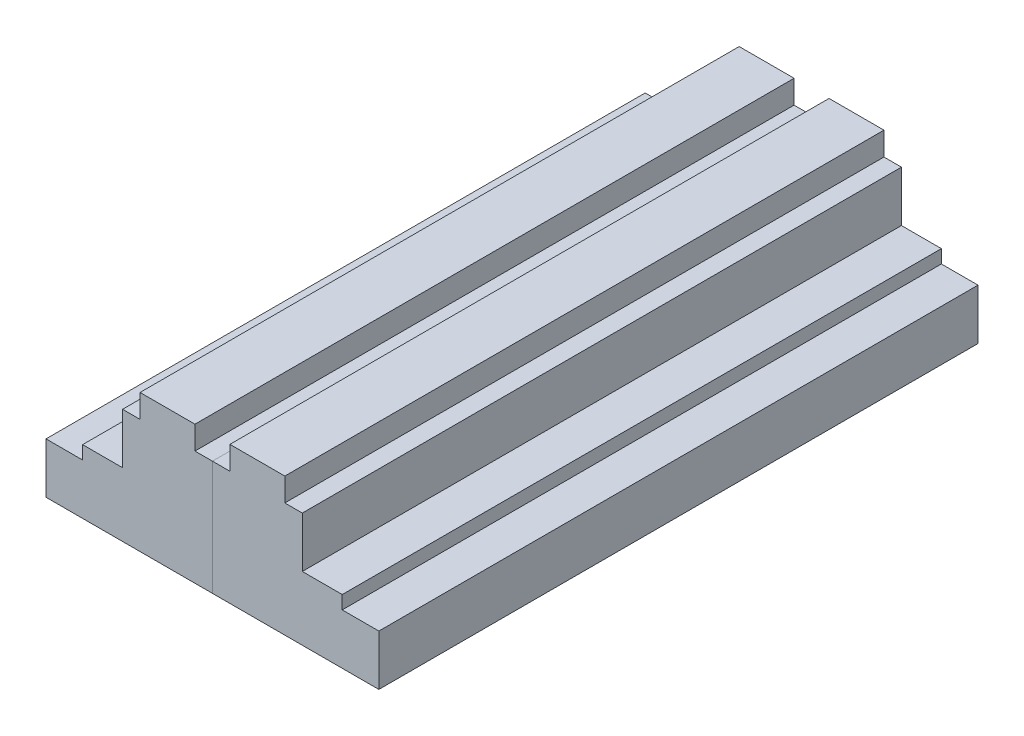
ISO-10303-21;
HEADER;
FILE_DESCRIPTION(('STEP AP214'),'2;1');
FILE_NAME('part.step','',(''),(''),'','','');
FILE_SCHEMA(('AUTOMOTIVE_DESIGN { 1 0 10303 214 1 1 1 1 }'));
ENDSEC;
DATA;
#1=APPLICATION_CONTEXT('core data for automotive mechanical design processes');
#2=APPLICATION_PROTOCOL_DEFINITION('international standard','automotive_design',2000,#1);
#3=PRODUCT_CONTEXT('',#1,'mechanical');
#4=PRODUCT('Part','Part','',(#3));
#5=PRODUCT_RELATED_PRODUCT_CATEGORY('part','',(#4));
#6=PRODUCT_DEFINITION_FORMATION('','',#4);
#7=PRODUCT_DEFINITION_CONTEXT('part definition',#1,'design');
#8=PRODUCT_DEFINITION('design','',#6,#7);
#9=PRODUCT_DEFINITION_SHAPE('','',#8);
#10=(LENGTH_UNIT() NAMED_UNIT(*) SI_UNIT(.MILLI.,.METRE.));
#11=(NAMED_UNIT(*) PLANE_ANGLE_UNIT() SI_UNIT($,.RADIAN.));
#12=(NAMED_UNIT(*) SI_UNIT($,.STERADIAN.) SOLID_ANGLE_UNIT());
#13=UNCERTAINTY_MEASURE_WITH_UNIT(LENGTH_MEASURE(1.E-05),#10,'distance_accuracy_value','');
#14=(GEOMETRIC_REPRESENTATION_CONTEXT(3) GLOBAL_UNCERTAINTY_ASSIGNED_CONTEXT((#13)) GLOBAL_UNIT_ASSIGNED_CONTEXT((#10,
#11,#12)) REPRESENTATION_CONTEXT('',''));
#15=CARTESIAN_POINT('',(0.,0.,0.));
#16=DIRECTION('',(0.,0.,1.));
#17=DIRECTION('',(1.,0.,0.));
#18=AXIS2_PLACEMENT_3D('',#15,#16,#17);
#19=CARTESIAN_POINT('',(25.,0.,90.));
#20=DIRECTION('',(1.,0.,0.));
#21=DIRECTION('',(0.,0.,1.));
#22=AXIS2_PLACEMENT_3D('',#19,#20,#21);
#23=PLANE('',#22);
#24=DIRECTION('',(0.,1.,0.));
#25=VECTOR('',#24,1.);
#26=CARTESIAN_POINT('',(25.,0.,0.));
#27=LINE('',#26,#25);
#28=CARTESIAN_POINT('',(25.,0.,0.));
#29=VERTEX_POINT('',#28);
#30=CARTESIAN_POINT('',(25.,7.59999999999999,0.));
#31=VERTEX_POINT('',#30);
#32=EDGE_CURVE('E171',#29,#31,#27,.T.);
#33=ORIENTED_EDGE('',*,*,#32,.T.);
#34=DIRECTION('',(0.,0.,-1.));
#35=VECTOR('',#34,1.);
#36=CARTESIAN_POINT('',(25.,7.59999999999999,90.));
#37=LINE('',#36,#35);
#38=CARTESIAN_POINT('',(25.,7.59999999999999,90.));
#39=VERTEX_POINT('',#38);
#40=EDGE_CURVE('E54',#39,#31,#37,.T.);
#41=ORIENTED_EDGE('',*,*,#40,.F.);
#42=DIRECTION('',(0.,1.,0.));
#43=VECTOR('',#42,1.);
#44=CARTESIAN_POINT('',(25.,0.,90.));
#45=LINE('',#44,#43);
#46=CARTESIAN_POINT('',(25.,0.,90.));
#47=VERTEX_POINT('',#46);
#48=EDGE_CURVE('E192',#47,#39,#45,.T.);
#49=ORIENTED_EDGE('',*,*,#48,.F.);
#50=DIRECTION('',(0.,0.,-1.));
#51=VECTOR('',#50,1.);
#52=CARTESIAN_POINT('',(25.,0.,90.));
#53=LINE('',#52,#51);
#54=EDGE_CURVE('E12',#47,#29,#53,.T.);
#55=ORIENTED_EDGE('',*,*,#54,.T.);
#56=EDGE_LOOP('',(#33,#41,#49,#55));
#57=FACE_BOUND('',#56,.T.);
#58=ADVANCED_FACE('F51',(#57),#23,.T.);
#59=CARTESIAN_POINT('',(25.,0.,90.));
#60=DIRECTION('',(0.,1.,0.));
#61=DIRECTION('',(0.,0.,1.));
#62=AXIS2_PLACEMENT_3D('',#59,#60,#61);
#63=PLANE('',#62);
#64=DIRECTION('',(-1.,0.,0.));
#65=VECTOR('',#64,1.);
#66=CARTESIAN_POINT('',(25.,0.,0.));
#67=LINE('',#66,#65);
#68=CARTESIAN_POINT('',(0.,0.,0.));
#69=VERTEX_POINT('',#68);
#70=EDGE_CURVE('E116',#29,#69,#67,.T.);
#71=ORIENTED_EDGE('',*,*,#70,.F.);
#72=ORIENTED_EDGE('',*,*,#54,.F.);
#73=DIRECTION('',(-1.,0.,0.));
#74=VECTOR('',#73,1.);
#75=CARTESIAN_POINT('',(25.,0.,90.));
#76=LINE('',#75,#74);
#77=CARTESIAN_POINT('',(0.,0.,90.));
#78=VERTEX_POINT('',#77);
#79=EDGE_CURVE('E69',#47,#78,#76,.T.);
#80=ORIENTED_EDGE('',*,*,#79,.T.);
#81=DIRECTION('',(0.,0.,-1.));
#82=VECTOR('',#81,1.);
#83=CARTESIAN_POINT('',(0.,0.,90.));
#84=LINE('',#83,#82);
#85=EDGE_CURVE('E60',#78,#69,#84,.T.);
#86=ORIENTED_EDGE('',*,*,#85,.T.);
#87=EDGE_LOOP('',(#71,#72,#80,#86));
#88=FACE_BOUND('',#87,.T.);
#89=ADVANCED_FACE('F277',(#88),#63,.F.);
#90=CARTESIAN_POINT('',(0.,17.2,90.));
#91=DIRECTION('',(-1.,0.,0.));
#92=DIRECTION('',(0.,1.,0.));
#93=AXIS2_PLACEMENT_3D('',#90,#91,#92);
#94=PLANE('',#93);
#95=DIRECTION('',(0.,-1.,0.));
#96=VECTOR('',#95,1.);
#97=CARTESIAN_POINT('',(0.,17.2,0.));
#98=LINE('',#97,#96);
#99=CARTESIAN_POINT('',(0.,17.2,0.));
#100=VERTEX_POINT('',#99);
#101=EDGE_CURVE('E110',#100,#69,#98,.T.);
#102=ORIENTED_EDGE('',*,*,#101,.T.);
#103=ORIENTED_EDGE('',*,*,#85,.F.);
#104=DIRECTION('',(0.,-1.,0.));
#105=VECTOR('',#104,1.);
#106=CARTESIAN_POINT('',(0.,17.2,90.));
#107=LINE('',#106,#105);
#108=CARTESIAN_POINT('',(0.,17.2,90.));
#109=VERTEX_POINT('',#108);
#110=EDGE_CURVE('E153',#109,#78,#107,.T.);
#111=ORIENTED_EDGE('',*,*,#110,.F.);
#112=DIRECTION('',(0.,0.,-1.));
#113=VECTOR('',#112,1.);
#114=CARTESIAN_POINT('',(0.,17.2,90.));
#115=LINE('',#114,#113);
#116=EDGE_CURVE('E160',#109,#100,#115,.T.);
#117=ORIENTED_EDGE('',*,*,#116,.T.);
#118=EDGE_LOOP('',(#102,#103,#111,#117));
#119=FACE_BOUND('',#118,.T.);
#120=ADVANCED_FACE('F166',(#119),#94,.T.);
#121=CARTESIAN_POINT('',(2.62500000000001,17.2,90.));
#122=DIRECTION('',(0.,1.,0.));
#123=DIRECTION('',(0.,0.,1.));
#124=AXIS2_PLACEMENT_3D('',#121,#122,#123);
#125=PLANE('',#124);
#126=DIRECTION('',(-1.,0.,0.));
#127=VECTOR('',#126,1.);
#128=CARTESIAN_POINT('',(2.62500000000001,17.2,0.));
#129=LINE('',#128,#127);
#130=CARTESIAN_POINT('',(2.62500000000001,17.2,0.));
#131=VERTEX_POINT('',#130);
#132=EDGE_CURVE('E163',#131,#100,#129,.T.);
#133=ORIENTED_EDGE('',*,*,#132,.T.);
#134=ORIENTED_EDGE('',*,*,#116,.F.);
#135=DIRECTION('',(-1.,0.,0.));
#136=VECTOR('',#135,1.);
#137=CARTESIAN_POINT('',(2.62500000000001,17.2,90.));
#138=LINE('',#137,#136);
#139=CARTESIAN_POINT('',(2.62500000000001,17.2,90.));
#140=VERTEX_POINT('',#139);
#141=EDGE_CURVE('E149',#140,#109,#138,.T.);
#142=ORIENTED_EDGE('',*,*,#141,.F.);
#143=DIRECTION('',(0.,0.,-1.));
#144=VECTOR('',#143,1.);
#145=CARTESIAN_POINT('',(2.62500000000001,17.2,90.));
#146=LINE('',#145,#144);
#147=EDGE_CURVE('E164',#140,#131,#146,.T.);
#148=ORIENTED_EDGE('',*,*,#147,.T.);
#149=EDGE_LOOP('',(#133,#134,#142,#148));
#150=FACE_BOUND('',#149,.T.);
#151=ADVANCED_FACE('F161',(#150),#125,.T.);
#152=CARTESIAN_POINT('',(2.62500000000001,20.7,90.));
#153=DIRECTION('',(-1.,0.,0.));
#154=DIRECTION('',(0.,1.,0.));
#155=AXIS2_PLACEMENT_3D('',#152,#153,#154);
#156=PLANE('',#155);
#157=DIRECTION('',(0.,-1.,0.));
#158=VECTOR('',#157,1.);
#159=CARTESIAN_POINT('',(2.62500000000001,20.7,0.));
#160=LINE('',#159,#158);
#161=CARTESIAN_POINT('',(2.62500000000001,20.7,0.));
#162=VERTEX_POINT('',#161);
#163=EDGE_CURVE('E188',#162,#131,#160,.T.);
#164=ORIENTED_EDGE('',*,*,#163,.T.);
#165=ORIENTED_EDGE('',*,*,#147,.F.);
#166=DIRECTION('',(0.,-1.,0.));
#167=VECTOR('',#166,1.);
#168=CARTESIAN_POINT('',(2.62500000000001,20.7,90.));
#169=LINE('',#168,#167);
#170=CARTESIAN_POINT('',(2.62500000000001,20.7,90.));
#171=VERTEX_POINT('',#170);
#172=EDGE_CURVE('E155',#171,#140,#169,.T.);
#173=ORIENTED_EDGE('',*,*,#172,.F.);
#174=DIRECTION('',(0.,0.,-1.));
#175=VECTOR('',#174,1.);
#176=CARTESIAN_POINT('',(2.62500000000001,20.7,90.));
#177=LINE('',#176,#175);
#178=EDGE_CURVE('E196',#171,#162,#177,.T.);
#179=ORIENTED_EDGE('',*,*,#178,.T.);
#180=EDGE_LOOP('',(#164,#165,#173,#179));
#181=FACE_BOUND('',#180,.T.);
#182=ADVANCED_FACE('F256',(#181),#156,.T.);
#183=CARTESIAN_POINT('',(10.875,20.7,90.));
#184=DIRECTION('',(0.,1.,0.));
#185=DIRECTION('',(1.,0.,0.));
#186=AXIS2_PLACEMENT_3D('',#183,#184,#185);
#187=PLANE('',#186);
#188=DIRECTION('',(-1.,0.,0.));
#189=VECTOR('',#188,1.);
#190=CARTESIAN_POINT('',(10.875,20.7,0.));
#191=LINE('',#190,#189);
#192=CARTESIAN_POINT('',(10.875,20.7,0.));
#193=VERTEX_POINT('',#192);
#194=EDGE_CURVE('E186',#193,#162,#191,.T.);
#195=ORIENTED_EDGE('',*,*,#194,.T.);
#196=ORIENTED_EDGE('',*,*,#178,.F.);
#197=DIRECTION('',(-1.,0.,0.));
#198=VECTOR('',#197,1.);
#199=CARTESIAN_POINT('',(10.875,20.7,90.));
#200=LINE('',#199,#198);
#201=CARTESIAN_POINT('',(10.875,20.7,90.));
#202=VERTEX_POINT('',#201);
#203=EDGE_CURVE('E246',#202,#171,#200,.T.);
#204=ORIENTED_EDGE('',*,*,#203,.F.);
#205=DIRECTION('',(0.,0.,-1.));
#206=VECTOR('',#205,1.);
#207=CARTESIAN_POINT('',(10.875,20.7,90.));
#208=LINE('',#207,#206);
#209=EDGE_CURVE('E199',#202,#193,#208,.T.);
#210=ORIENTED_EDGE('',*,*,#209,.T.);
#211=EDGE_LOOP('',(#195,#196,#204,#210));
#212=FACE_BOUND('',#211,.T.);
#213=ADVANCED_FACE('F252',(#212),#187,.T.);
#214=CARTESIAN_POINT('',(10.875,17.2,90.));
#215=DIRECTION('',(1.,0.,0.));
#216=DIRECTION('',(0.,-1.,0.));
#217=AXIS2_PLACEMENT_3D('',#214,#215,#216);
#218=PLANE('',#217);
#219=DIRECTION('',(0.,1.,0.));
#220=VECTOR('',#219,1.);
#221=CARTESIAN_POINT('',(10.875,17.2,0.));
#222=LINE('',#221,#220);
#223=CARTESIAN_POINT('',(10.875,17.2,0.));
#224=VERTEX_POINT('',#223);
#225=EDGE_CURVE('E184',#224,#193,#222,.T.);
#226=ORIENTED_EDGE('',*,*,#225,.T.);
#227=ORIENTED_EDGE('',*,*,#209,.F.);
#228=DIRECTION('',(0.,1.,0.));
#229=VECTOR('',#228,1.);
#230=CARTESIAN_POINT('',(10.875,17.2,90.));
#231=LINE('',#230,#229);
#232=CARTESIAN_POINT('',(10.875,17.2,90.));
#233=VERTEX_POINT('',#232);
#234=EDGE_CURVE('E244',#233,#202,#231,.T.);
#235=ORIENTED_EDGE('',*,*,#234,.F.);
#236=DIRECTION('',(0.,0.,-1.));
#237=VECTOR('',#236,1.);
#238=CARTESIAN_POINT('',(10.875,17.2,90.));
#239=LINE('',#238,#237);
#240=EDGE_CURVE('E202',#233,#224,#239,.T.);
#241=ORIENTED_EDGE('',*,*,#240,.T.);
#242=EDGE_LOOP('',(#226,#227,#235,#241));
#243=FACE_BOUND('',#242,.T.);
#244=ADVANCED_FACE('F260',(#243),#218,.T.);
#245=CARTESIAN_POINT('',(13.5,17.2,90.));
#246=DIRECTION('',(0.,1.,0.));
#247=DIRECTION('',(0.,0.,1.));
#248=AXIS2_PLACEMENT_3D('',#245,#246,#247);
#249=PLANE('',#248);
#250=DIRECTION('',(-1.,0.,0.));
#251=VECTOR('',#250,1.);
#252=CARTESIAN_POINT('',(13.5,17.2,0.));
#253=LINE('',#252,#251);
#254=CARTESIAN_POINT('',(13.5,17.2,0.));
#255=VERTEX_POINT('',#254);
#256=EDGE_CURVE('E182',#255,#224,#253,.T.);
#257=ORIENTED_EDGE('',*,*,#256,.T.);
#258=ORIENTED_EDGE('',*,*,#240,.F.);
#259=DIRECTION('',(-1.,0.,0.));
#260=VECTOR('',#259,1.);
#261=CARTESIAN_POINT('',(13.5,17.2,90.));
#262=LINE('',#261,#260);
#263=CARTESIAN_POINT('',(13.5,17.2,90.));
#264=VERTEX_POINT('',#263);
#265=EDGE_CURVE('E238',#264,#233,#262,.T.);
#266=ORIENTED_EDGE('',*,*,#265,.F.);
#267=DIRECTION('',(0.,0.,-1.));
#268=VECTOR('',#267,1.);
#269=CARTESIAN_POINT('',(13.5,17.2,90.));
#270=LINE('',#269,#268);
#271=EDGE_CURVE('E205',#264,#255,#270,.T.);
#272=ORIENTED_EDGE('',*,*,#271,.T.);
#273=EDGE_LOOP('',(#257,#258,#266,#272));
#274=FACE_BOUND('',#273,.T.);
#275=ADVANCED_FACE('F264',(#274),#249,.T.);
#276=CARTESIAN_POINT('',(13.5,9.6,90.));
#277=DIRECTION('',(1.,0.,0.));
#278=DIRECTION('',(0.,-1.,0.));
#279=AXIS2_PLACEMENT_3D('',#276,#277,#278);
#280=PLANE('',#279);
#281=DIRECTION('',(0.,1.,0.));
#282=VECTOR('',#281,1.);
#283=CARTESIAN_POINT('',(13.5,9.6,0.));
#284=LINE('',#283,#282);
#285=CARTESIAN_POINT('',(13.5,9.6,0.));
#286=VERTEX_POINT('',#285);
#287=EDGE_CURVE('E180',#286,#255,#284,.T.);
#288=ORIENTED_EDGE('',*,*,#287,.T.);
#289=ORIENTED_EDGE('',*,*,#271,.F.);
#290=DIRECTION('',(0.,1.,0.));
#291=VECTOR('',#290,1.);
#292=CARTESIAN_POINT('',(13.5,9.6,90.));
#293=LINE('',#292,#291);
#294=CARTESIAN_POINT('',(13.5,9.6,90.));
#295=VERTEX_POINT('',#294);
#296=EDGE_CURVE('E235',#295,#264,#293,.T.);
#297=ORIENTED_EDGE('',*,*,#296,.F.);
#298=DIRECTION('',(0.,0.,-1.));
#299=VECTOR('',#298,1.);
#300=CARTESIAN_POINT('',(13.5,9.6,90.));
#301=LINE('',#300,#299);
#302=EDGE_CURVE('E208',#295,#286,#301,.T.);
#303=ORIENTED_EDGE('',*,*,#302,.T.);
#304=EDGE_LOOP('',(#288,#289,#297,#303));
#305=FACE_BOUND('',#304,.T.);
#306=ADVANCED_FACE('F267',(#305),#280,.T.);
#307=CARTESIAN_POINT('',(19.5,9.59999999999999,90.));
#308=DIRECTION('',(0.,1.,0.));
#309=DIRECTION('',(0.,0.,1.));
#310=AXIS2_PLACEMENT_3D('',#307,#308,#309);
#311=PLANE('',#310);
#312=DIRECTION('',(-1.,0.,0.));
#313=VECTOR('',#312,1.);
#314=CARTESIAN_POINT('',(19.5,9.59999999999999,0.));
#315=LINE('',#314,#313);
#316=CARTESIAN_POINT('',(19.5,9.59999999999999,0.));
#317=VERTEX_POINT('',#316);
#318=EDGE_CURVE('E178',#317,#286,#315,.T.);
#319=ORIENTED_EDGE('',*,*,#318,.T.);
#320=ORIENTED_EDGE('',*,*,#302,.F.);
#321=DIRECTION('',(-1.,0.,0.));
#322=VECTOR('',#321,1.);
#323=CARTESIAN_POINT('',(19.5,9.59999999999999,90.));
#324=LINE('',#323,#322);
#325=CARTESIAN_POINT('',(19.5,9.59999999999999,90.));
#326=VERTEX_POINT('',#325);
#327=EDGE_CURVE('E233',#326,#295,#324,.T.);
#328=ORIENTED_EDGE('',*,*,#327,.F.);
#329=DIRECTION('',(0.,0.,-1.));
#330=VECTOR('',#329,1.);
#331=CARTESIAN_POINT('',(19.5,9.59999999999999,90.));
#332=LINE('',#331,#330);
#333=EDGE_CURVE('E211',#326,#317,#332,.T.);
#334=ORIENTED_EDGE('',*,*,#333,.T.);
#335=EDGE_LOOP('',(#319,#320,#328,#334));
#336=FACE_BOUND('',#335,.T.);
#337=ADVANCED_FACE('F231',(#336),#311,.T.);
#338=CARTESIAN_POINT('',(19.5,7.59999999999999,90.));
#339=DIRECTION('',(1.,0.,0.));
#340=DIRECTION('',(0.,0.,1.));
#341=AXIS2_PLACEMENT_3D('',#338,#339,#340);
#342=PLANE('',#341);
#343=DIRECTION('',(0.,1.,0.));
#344=VECTOR('',#343,1.);
#345=CARTESIAN_POINT('',(19.5,7.59999999999999,0.));
#346=LINE('',#345,#344);
#347=CARTESIAN_POINT('',(19.5,7.59999999999999,0.));
#348=VERTEX_POINT('',#347);
#349=EDGE_CURVE('E176',#348,#317,#346,.T.);
#350=ORIENTED_EDGE('',*,*,#349,.T.);
#351=ORIENTED_EDGE('',*,*,#333,.F.);
#352=DIRECTION('',(0.,1.,0.));
#353=VECTOR('',#352,1.);
#354=CARTESIAN_POINT('',(19.5,7.59999999999999,90.));
#355=LINE('',#354,#353);
#356=CARTESIAN_POINT('',(19.5,7.59999999999999,90.));
#357=VERTEX_POINT('',#356);
#358=EDGE_CURVE('E236',#357,#326,#355,.T.);
#359=ORIENTED_EDGE('',*,*,#358,.F.);
#360=DIRECTION('',(0.,0.,-1.));
#361=VECTOR('',#360,1.);
#362=CARTESIAN_POINT('',(19.5,7.59999999999999,90.));
#363=LINE('',#362,#361);
#364=EDGE_CURVE('E213',#357,#348,#363,.T.);
#365=ORIENTED_EDGE('',*,*,#364,.T.);
#366=EDGE_LOOP('',(#350,#351,#359,#365));
#367=FACE_BOUND('',#366,.T.);
#368=ADVANCED_FACE('F228',(#367),#342,.T.);
#369=CARTESIAN_POINT('',(25.,7.59999999999999,90.));
#370=DIRECTION('',(0.,1.,0.));
#371=DIRECTION('',(0.,0.,1.));
#372=AXIS2_PLACEMENT_3D('',#369,#370,#371);
#373=PLANE('',#372);
#374=DIRECTION('',(-1.,0.,0.));
#375=VECTOR('',#374,1.);
#376=CARTESIAN_POINT('',(25.,7.59999999999999,0.));
#377=LINE('',#376,#375);
#378=EDGE_CURVE('E174',#31,#348,#377,.T.);
#379=ORIENTED_EDGE('',*,*,#378,.T.);
#380=ORIENTED_EDGE('',*,*,#364,.F.);
#381=DIRECTION('',(-1.,0.,0.));
#382=VECTOR('',#381,1.);
#383=CARTESIAN_POINT('',(25.,7.59999999999999,90.));
#384=LINE('',#383,#382);
#385=EDGE_CURVE('E124',#39,#357,#384,.T.);
#386=ORIENTED_EDGE('',*,*,#385,.F.);
#387=ORIENTED_EDGE('',*,*,#40,.T.);
#388=EDGE_LOOP('',(#379,#380,#386,#387));
#389=FACE_BOUND('',#388,.T.);
#390=ADVANCED_FACE('F219',(#389),#373,.T.);
#391=CARTESIAN_POINT('',(0.,0.,90.));
#392=DIRECTION('',(0.,0.,-1.));
#393=DIRECTION('',(1.,0.,0.));
#394=AXIS2_PLACEMENT_3D('',#391,#392,#393);
#395=PLANE('',#394);
#396=ORIENTED_EDGE('',*,*,#48,.T.);
#397=ORIENTED_EDGE('',*,*,#385,.T.);
#398=ORIENTED_EDGE('',*,*,#358,.T.);
#399=ORIENTED_EDGE('',*,*,#327,.T.);
#400=ORIENTED_EDGE('',*,*,#296,.T.);
#401=ORIENTED_EDGE('',*,*,#265,.T.);
#402=ORIENTED_EDGE('',*,*,#234,.T.);
#403=ORIENTED_EDGE('',*,*,#203,.T.);
#404=ORIENTED_EDGE('',*,*,#172,.T.);
#405=ORIENTED_EDGE('',*,*,#141,.T.);
#406=ORIENTED_EDGE('',*,*,#110,.T.);
#407=ORIENTED_EDGE('',*,*,#79,.F.);
#408=EDGE_LOOP('',(#396,#397,#398,#399,#400,#401,#402,#403,#404,#405,#406,#407));
#409=FACE_BOUND('',#408,.T.);
#410=ADVANCED_FACE('F151',(#409),#395,.F.);
#411=CARTESIAN_POINT('',(0.,0.,0.));
#412=DIRECTION('',(0.,0.,-1.));
#413=DIRECTION('',(1.,0.,0.));
#414=AXIS2_PLACEMENT_3D('',#411,#412,#413);
#415=PLANE('',#414);
#416=ORIENTED_EDGE('',*,*,#32,.F.);
#417=ORIENTED_EDGE('',*,*,#70,.T.);
#418=ORIENTED_EDGE('',*,*,#101,.F.);
#419=ORIENTED_EDGE('',*,*,#132,.F.);
#420=ORIENTED_EDGE('',*,*,#163,.F.);
#421=ORIENTED_EDGE('',*,*,#194,.F.);
#422=ORIENTED_EDGE('',*,*,#225,.F.);
#423=ORIENTED_EDGE('',*,*,#256,.F.);
#424=ORIENTED_EDGE('',*,*,#287,.F.);
#425=ORIENTED_EDGE('',*,*,#318,.F.);
#426=ORIENTED_EDGE('',*,*,#349,.F.);
#427=ORIENTED_EDGE('',*,*,#378,.F.);
#428=EDGE_LOOP('',(#416,#417,#418,#419,#420,#421,#422,#423,#424,#425,#426,#427));
#429=FACE_BOUND('',#428,.T.);
#430=ADVANCED_FACE('F224',(#429),#415,.T.);
#431=CLOSED_SHELL('',(#58,#89,#120,#151,#182,#213,#244,#275,#306,#337,#368,#390,#410,#430));
#432=MANIFOLD_SOLID_BREP('B2',#431);
#433=CARTESIAN_POINT('',(-25.,0.,90.));
#434=DIRECTION('',(-1.,0.,0.));
#435=DIRECTION('',(0.,0.,1.));
#436=AXIS2_PLACEMENT_3D('',#433,#434,#435);
#437=PLANE('',#436);
#438=DIRECTION('',(0.,1.,0.));
#439=VECTOR('',#438,1.);
#440=CARTESIAN_POINT('',(-25.,0.,0.));
#441=LINE('',#440,#439);
#442=CARTESIAN_POINT('',(-25.,0.,0.));
#443=VERTEX_POINT('',#442);
#444=CARTESIAN_POINT('',(-25.,7.6,0.));
#445=VERTEX_POINT('',#444);
#446=EDGE_CURVE('E505',#443,#445,#441,.T.);
#447=ORIENTED_EDGE('',*,*,#446,.F.);
#448=DIRECTION('',(0.,0.,-1.));
#449=VECTOR('',#448,1.);
#450=CARTESIAN_POINT('',(-25.,0.,90.));
#451=LINE('',#450,#449);
#452=CARTESIAN_POINT('',(-25.,0.,90.));
#453=VERTEX_POINT('',#452);
#454=EDGE_CURVE('E49',#453,#443,#451,.T.);
#455=ORIENTED_EDGE('',*,*,#454,.F.);
#456=DIRECTION('',(0.,1.,0.));
#457=VECTOR('',#456,1.);
#458=CARTESIAN_POINT('',(-25.,0.,90.));
#459=LINE('',#458,#457);
#460=CARTESIAN_POINT('',(-25.,7.6,90.));
#461=VERTEX_POINT('',#460);
#462=EDGE_CURVE('E536',#453,#461,#459,.T.);
#463=ORIENTED_EDGE('',*,*,#462,.T.);
#464=DIRECTION('',(0.,0.,-1.));
#465=VECTOR('',#464,1.);
#466=CARTESIAN_POINT('',(-25.,7.6,90.));
#467=LINE('',#466,#465);
#468=EDGE_CURVE('E386',#461,#445,#467,.T.);
#469=ORIENTED_EDGE('',*,*,#468,.T.);
#470=EDGE_LOOP('',(#447,#455,#463,#469));
#471=FACE_BOUND('',#470,.T.);
#472=ADVANCED_FACE('F383',(#471),#437,.T.);
#473=CARTESIAN_POINT('',(-25.,0.,90.));
#474=DIRECTION('',(0.,1.,0.));
#475=DIRECTION('',(0.,0.,1.));
#476=AXIS2_PLACEMENT_3D('',#473,#474,#475);
#477=PLANE('',#476);
#478=DIRECTION('',(1.,0.,0.));
#479=VECTOR('',#478,1.);
#480=CARTESIAN_POINT('',(-25.,0.,0.));
#481=LINE('',#480,#479);
#482=CARTESIAN_POINT('',(0.,0.,0.));
#483=VERTEX_POINT('',#482);
#484=EDGE_CURVE('E535',#443,#483,#481,.T.);
#485=ORIENTED_EDGE('',*,*,#484,.T.);
#486=DIRECTION('',(0.,0.,-1.));
#487=VECTOR('',#486,1.);
#488=CARTESIAN_POINT('',(0.,0.,90.));
#489=LINE('',#488,#487);
#490=CARTESIAN_POINT('',(0.,0.,90.));
#491=VERTEX_POINT('',#490);
#492=EDGE_CURVE('E392',#491,#483,#489,.T.);
#493=ORIENTED_EDGE('',*,*,#492,.F.);
#494=DIRECTION('',(1.,0.,0.));
#495=VECTOR('',#494,1.);
#496=CARTESIAN_POINT('',(-25.,0.,90.));
#497=LINE('',#496,#495);
#498=EDGE_CURVE('E495',#453,#491,#497,.T.);
#499=ORIENTED_EDGE('',*,*,#498,.F.);
#500=ORIENTED_EDGE('',*,*,#454,.T.);
#501=EDGE_LOOP('',(#485,#493,#499,#500));
#502=FACE_BOUND('',#501,.T.);
#503=ADVANCED_FACE('F556',(#502),#477,.F.);
#504=CARTESIAN_POINT('',(0.,17.2,90.));
#505=DIRECTION('',(1.,0.,0.));
#506=DIRECTION('',(0.,1.,0.));
#507=AXIS2_PLACEMENT_3D('',#504,#505,#506);
#508=PLANE('',#507);
#509=DIRECTION('',(0.,-1.,0.));
#510=VECTOR('',#509,1.);
#511=CARTESIAN_POINT('',(0.,17.2,0.));
#512=LINE('',#511,#510);
#513=CARTESIAN_POINT('',(0.,17.2,0.));
#514=VERTEX_POINT('',#513);
#515=EDGE_CURVE('E481',#514,#483,#512,.T.);
#516=ORIENTED_EDGE('',*,*,#515,.F.);
#517=DIRECTION('',(0.,0.,-1.));
#518=VECTOR('',#517,1.);
#519=CARTESIAN_POINT('',(0.,17.2,90.));
#520=LINE('',#519,#518);
#521=CARTESIAN_POINT('',(0.,17.2,90.));
#522=VERTEX_POINT('',#521);
#523=EDGE_CURVE('E476',#522,#514,#520,.T.);
#524=ORIENTED_EDGE('',*,*,#523,.F.);
#525=DIRECTION('',(0.,-1.,0.));
#526=VECTOR('',#525,1.);
#527=CARTESIAN_POINT('',(0.,17.2,90.));
#528=LINE('',#527,#526);
#529=EDGE_CURVE('E479',#522,#491,#528,.T.);
#530=ORIENTED_EDGE('',*,*,#529,.T.);
#531=ORIENTED_EDGE('',*,*,#492,.T.);
#532=EDGE_LOOP('',(#516,#524,#530,#531));
#533=FACE_BOUND('',#532,.T.);
#534=ADVANCED_FACE('F478',(#533),#508,.T.);
#535=CARTESIAN_POINT('',(-2.625,17.2,90.));
#536=DIRECTION('',(0.,1.,0.));
#537=DIRECTION('',(0.,0.,1.));
#538=AXIS2_PLACEMENT_3D('',#535,#536,#537);
#539=PLANE('',#538);
#540=DIRECTION('',(1.,0.,0.));
#541=VECTOR('',#540,1.);
#542=CARTESIAN_POINT('',(-2.625,17.2,0.));
#543=LINE('',#542,#541);
#544=CARTESIAN_POINT('',(-2.625,17.2,0.));
#545=VERTEX_POINT('',#544);
#546=EDGE_CURVE('E532',#545,#514,#543,.T.);
#547=ORIENTED_EDGE('',*,*,#546,.F.);
#548=DIRECTION('',(0.,0.,-1.));
#549=VECTOR('',#548,1.);
#550=CARTESIAN_POINT('',(-2.625,17.2,90.));
#551=LINE('',#550,#549);
#552=CARTESIAN_POINT('',(-2.625,17.2,90.));
#553=VERTEX_POINT('',#552);
#554=EDGE_CURVE('E486',#553,#545,#551,.T.);
#555=ORIENTED_EDGE('',*,*,#554,.F.);
#556=DIRECTION('',(1.,0.,0.));
#557=VECTOR('',#556,1.);
#558=CARTESIAN_POINT('',(-2.625,17.2,90.));
#559=LINE('',#558,#557);
#560=EDGE_CURVE('E493',#553,#522,#559,.T.);
#561=ORIENTED_EDGE('',*,*,#560,.T.);
#562=ORIENTED_EDGE('',*,*,#523,.T.);
#563=EDGE_LOOP('',(#547,#555,#561,#562));
#564=FACE_BOUND('',#563,.T.);
#565=ADVANCED_FACE('F497',(#564),#539,.T.);
#566=CARTESIAN_POINT('',(-2.625,20.7,90.));
#567=DIRECTION('',(1.,0.,0.));
#568=DIRECTION('',(0.,1.,0.));
#569=AXIS2_PLACEMENT_3D('',#566,#567,#568);
#570=PLANE('',#569);
#571=DIRECTION('',(0.,-1.,0.));
#572=VECTOR('',#571,1.);
#573=CARTESIAN_POINT('',(-2.625,20.7,0.));
#574=LINE('',#573,#572);
#575=CARTESIAN_POINT('',(-2.625,20.7,0.));
#576=VERTEX_POINT('',#575);
#577=EDGE_CURVE('E529',#576,#545,#574,.T.);
#578=ORIENTED_EDGE('',*,*,#577,.F.);
#579=DIRECTION('',(0.,0.,-1.));
#580=VECTOR('',#579,1.);
#581=CARTESIAN_POINT('',(-2.625,20.7,90.));
#582=LINE('',#581,#580);
#583=CARTESIAN_POINT('',(-2.625,20.7,90.));
#584=VERTEX_POINT('',#583);
#585=EDGE_CURVE('E540',#584,#576,#582,.T.);
#586=ORIENTED_EDGE('',*,*,#585,.F.);
#587=DIRECTION('',(0.,-1.,0.));
#588=VECTOR('',#587,1.);
#589=CARTESIAN_POINT('',(-2.625,20.7,90.));
#590=LINE('',#589,#588);
#591=EDGE_CURVE('E498',#584,#553,#590,.T.);
#592=ORIENTED_EDGE('',*,*,#591,.T.);
#593=ORIENTED_EDGE('',*,*,#554,.T.);
#594=EDGE_LOOP('',(#578,#586,#592,#593));
#595=FACE_BOUND('',#594,.T.);
#596=ADVANCED_FACE('F601',(#595),#570,.T.);
#597=CARTESIAN_POINT('',(-10.875,20.7,90.));
#598=DIRECTION('',(0.,1.,0.));
#599=DIRECTION('',(-1.,0.,0.));
#600=AXIS2_PLACEMENT_3D('',#597,#598,#599);
#601=PLANE('',#600);
#602=DIRECTION('',(1.,0.,0.));
#603=VECTOR('',#602,1.);
#604=CARTESIAN_POINT('',(-10.875,20.7,0.));
#605=LINE('',#604,#603);
#606=CARTESIAN_POINT('',(-10.875,20.7,0.));
#607=VERTEX_POINT('',#606);
#608=EDGE_CURVE('E526',#607,#576,#605,.T.);
#609=ORIENTED_EDGE('',*,*,#608,.F.);
#610=DIRECTION('',(0.,0.,-1.));
#611=VECTOR('',#610,1.);
#612=CARTESIAN_POINT('',(-10.875,20.7,90.));
#613=LINE('',#612,#611);
#614=CARTESIAN_POINT('',(-10.875,20.7,90.));
#615=VERTEX_POINT('',#614);
#616=EDGE_CURVE('E542',#615,#607,#613,.T.);
#617=ORIENTED_EDGE('',*,*,#616,.F.);
#618=DIRECTION('',(1.,0.,0.));
#619=VECTOR('',#618,1.);
#620=CARTESIAN_POINT('',(-10.875,20.7,90.));
#621=LINE('',#620,#619);
#622=EDGE_CURVE('E500',#615,#584,#621,.T.);
#623=ORIENTED_EDGE('',*,*,#622,.T.);
#624=ORIENTED_EDGE('',*,*,#585,.T.);
#625=EDGE_LOOP('',(#609,#617,#623,#624));
#626=FACE_BOUND('',#625,.T.);
#627=ADVANCED_FACE('F580',(#626),#601,.T.);
#628=CARTESIAN_POINT('',(-10.875,17.2,90.));
#629=DIRECTION('',(-1.,0.,0.));
#630=DIRECTION('',(0.,-1.,0.));
#631=AXIS2_PLACEMENT_3D('',#628,#629,#630);
#632=PLANE('',#631);
#633=DIRECTION('',(0.,1.,0.));
#634=VECTOR('',#633,1.);
#635=CARTESIAN_POINT('',(-10.875,17.2,0.));
#636=LINE('',#635,#634);
#637=CARTESIAN_POINT('',(-10.875,17.2,0.));
#638=VERTEX_POINT('',#637);
#639=EDGE_CURVE('E523',#638,#607,#636,.T.);
#640=ORIENTED_EDGE('',*,*,#639,.F.);
#641=DIRECTION('',(0.,0.,-1.));
#642=VECTOR('',#641,1.);
#643=CARTESIAN_POINT('',(-10.875,17.2,90.));
#644=LINE('',#643,#642);
#645=CARTESIAN_POINT('',(-10.875,17.2,90.));
#646=VERTEX_POINT('',#645);
#647=EDGE_CURVE('E544',#646,#638,#644,.T.);
#648=ORIENTED_EDGE('',*,*,#647,.F.);
#649=DIRECTION('',(0.,1.,0.));
#650=VECTOR('',#649,1.);
#651=CARTESIAN_POINT('',(-10.875,17.2,90.));
#652=LINE('',#651,#650);
#653=EDGE_CURVE('E574',#646,#615,#652,.T.);
#654=ORIENTED_EDGE('',*,*,#653,.T.);
#655=ORIENTED_EDGE('',*,*,#616,.T.);
#656=EDGE_LOOP('',(#640,#648,#654,#655));
#657=FACE_BOUND('',#656,.T.);
#658=ADVANCED_FACE('F586',(#657),#632,.T.);
#659=CARTESIAN_POINT('',(-13.5,17.2,90.));
#660=DIRECTION('',(0.,1.,0.));
#661=DIRECTION('',(0.,0.,1.));
#662=AXIS2_PLACEMENT_3D('',#659,#660,#661);
#663=PLANE('',#662);
#664=DIRECTION('',(1.,0.,0.));
#665=VECTOR('',#664,1.);
#666=CARTESIAN_POINT('',(-13.5,17.2,0.));
#667=LINE('',#666,#665);
#668=CARTESIAN_POINT('',(-13.5,17.2,0.));
#669=VERTEX_POINT('',#668);
#670=EDGE_CURVE('E520',#669,#638,#667,.T.);
#671=ORIENTED_EDGE('',*,*,#670,.F.);
#672=DIRECTION('',(0.,0.,-1.));
#673=VECTOR('',#672,1.);
#674=CARTESIAN_POINT('',(-13.5,17.2,90.));
#675=LINE('',#674,#673);
#676=CARTESIAN_POINT('',(-13.5,17.2,90.));
#677=VERTEX_POINT('',#676);
#678=EDGE_CURVE('E546',#677,#669,#675,.T.);
#679=ORIENTED_EDGE('',*,*,#678,.F.);
#680=DIRECTION('',(1.,0.,0.));
#681=VECTOR('',#680,1.);
#682=CARTESIAN_POINT('',(-13.5,17.2,90.));
#683=LINE('',#682,#681);
#684=EDGE_CURVE('E571',#677,#646,#683,.T.);
#685=ORIENTED_EDGE('',*,*,#684,.T.);
#686=ORIENTED_EDGE('',*,*,#647,.T.);
#687=EDGE_LOOP('',(#671,#679,#685,#686));
#688=FACE_BOUND('',#687,.T.);
#689=ADVANCED_FACE('F589',(#688),#663,.T.);
#690=CARTESIAN_POINT('',(-13.5,9.6,90.));
#691=DIRECTION('',(-1.,0.,0.));
#692=DIRECTION('',(0.,-1.,0.));
#693=AXIS2_PLACEMENT_3D('',#690,#691,#692);
#694=PLANE('',#693);
#695=DIRECTION('',(0.,1.,0.));
#696=VECTOR('',#695,1.);
#697=CARTESIAN_POINT('',(-13.5,9.6,0.));
#698=LINE('',#697,#696);
#699=CARTESIAN_POINT('',(-13.5,9.6,0.));
#700=VERTEX_POINT('',#699);
#701=EDGE_CURVE('E517',#700,#669,#698,.T.);
#702=ORIENTED_EDGE('',*,*,#701,.F.);
#703=DIRECTION('',(0.,0.,-1.));
#704=VECTOR('',#703,1.);
#705=CARTESIAN_POINT('',(-13.5,9.6,90.));
#706=LINE('',#705,#704);
#707=CARTESIAN_POINT('',(-13.5,9.6,90.));
#708=VERTEX_POINT('',#707);
#709=EDGE_CURVE('E548',#708,#700,#706,.T.);
#710=ORIENTED_EDGE('',*,*,#709,.F.);
#711=DIRECTION('',(0.,1.,0.));
#712=VECTOR('',#711,1.);
#713=CARTESIAN_POINT('',(-13.5,9.6,90.));
#714=LINE('',#713,#712);
#715=EDGE_CURVE('E568',#708,#677,#714,.T.);
#716=ORIENTED_EDGE('',*,*,#715,.T.);
#717=ORIENTED_EDGE('',*,*,#678,.T.);
#718=EDGE_LOOP('',(#702,#710,#716,#717));
#719=FACE_BOUND('',#718,.T.);
#720=ADVANCED_FACE('F594',(#719),#694,.T.);
#721=CARTESIAN_POINT('',(-19.5,9.6,90.));
#722=DIRECTION('',(0.,1.,0.));
#723=DIRECTION('',(0.,0.,1.));
#724=AXIS2_PLACEMENT_3D('',#721,#722,#723);
#725=PLANE('',#724);
#726=DIRECTION('',(1.,0.,0.));
#727=VECTOR('',#726,1.);
#728=CARTESIAN_POINT('',(-19.5,9.6,0.));
#729=LINE('',#728,#727);
#730=CARTESIAN_POINT('',(-19.5,9.6,0.));
#731=VERTEX_POINT('',#730);
#732=EDGE_CURVE('E514',#731,#700,#729,.T.);
#733=ORIENTED_EDGE('',*,*,#732,.F.);
#734=DIRECTION('',(0.,0.,-1.));
#735=VECTOR('',#734,1.);
#736=CARTESIAN_POINT('',(-19.5,9.6,90.));
#737=LINE('',#736,#735);
#738=CARTESIAN_POINT('',(-19.5,9.6,90.));
#739=VERTEX_POINT('',#738);
#740=EDGE_CURVE('E550',#739,#731,#737,.T.);
#741=ORIENTED_EDGE('',*,*,#740,.F.);
#742=DIRECTION('',(1.,0.,0.));
#743=VECTOR('',#742,1.);
#744=CARTESIAN_POINT('',(-19.5,9.6,90.));
#745=LINE('',#744,#743);
#746=EDGE_CURVE('E565',#739,#708,#745,.T.);
#747=ORIENTED_EDGE('',*,*,#746,.T.);
#748=ORIENTED_EDGE('',*,*,#709,.T.);
#749=EDGE_LOOP('',(#733,#741,#747,#748));
#750=FACE_BOUND('',#749,.T.);
#751=ADVANCED_FACE('F597',(#750),#725,.T.);
#752=CARTESIAN_POINT('',(-19.5,7.6,90.));
#753=DIRECTION('',(-1.,0.,0.));
#754=DIRECTION('',(0.,0.,1.));
#755=AXIS2_PLACEMENT_3D('',#752,#753,#754);
#756=PLANE('',#755);
#757=DIRECTION('',(0.,1.,0.));
#758=VECTOR('',#757,1.);
#759=CARTESIAN_POINT('',(-19.5,7.6,0.));
#760=LINE('',#759,#758);
#761=CARTESIAN_POINT('',(-19.5,7.6,0.));
#762=VERTEX_POINT('',#761);
#763=EDGE_CURVE('E511',#762,#731,#760,.T.);
#764=ORIENTED_EDGE('',*,*,#763,.F.);
#765=DIRECTION('',(0.,0.,-1.));
#766=VECTOR('',#765,1.);
#767=CARTESIAN_POINT('',(-19.5,7.6,90.));
#768=LINE('',#767,#766);
#769=CARTESIAN_POINT('',(-19.5,7.6,90.));
#770=VERTEX_POINT('',#769);
#771=EDGE_CURVE('E551',#770,#762,#768,.T.);
#772=ORIENTED_EDGE('',*,*,#771,.F.);
#773=DIRECTION('',(0.,1.,0.));
#774=VECTOR('',#773,1.);
#775=CARTESIAN_POINT('',(-19.5,7.6,90.));
#776=LINE('',#775,#774);
#777=EDGE_CURVE('E560',#770,#739,#776,.T.);
#778=ORIENTED_EDGE('',*,*,#777,.T.);
#779=ORIENTED_EDGE('',*,*,#740,.T.);
#780=EDGE_LOOP('',(#764,#772,#778,#779));
#781=FACE_BOUND('',#780,.T.);
#782=ADVANCED_FACE('F599',(#781),#756,.T.);
#783=CARTESIAN_POINT('',(-25.,7.6,90.));
#784=DIRECTION('',(0.,1.,0.));
#785=DIRECTION('',(0.,0.,1.));
#786=AXIS2_PLACEMENT_3D('',#783,#784,#785);
#787=PLANE('',#786);
#788=DIRECTION('',(1.,0.,0.));
#789=VECTOR('',#788,1.);
#790=CARTESIAN_POINT('',(-25.,7.6,0.));
#791=LINE('',#790,#789);
#792=EDGE_CURVE('E508',#445,#762,#791,.T.);
#793=ORIENTED_EDGE('',*,*,#792,.F.);
#794=ORIENTED_EDGE('',*,*,#468,.F.);
#795=DIRECTION('',(1.,0.,0.));
#796=VECTOR('',#795,1.);
#797=CARTESIAN_POINT('',(-25.,7.6,90.));
#798=LINE('',#797,#796);
#799=EDGE_CURVE('E558',#461,#770,#798,.T.);
#800=ORIENTED_EDGE('',*,*,#799,.T.);
#801=ORIENTED_EDGE('',*,*,#771,.T.);
#802=EDGE_LOOP('',(#793,#794,#800,#801));
#803=FACE_BOUND('',#802,.T.);
#804=ADVANCED_FACE('F553',(#803),#787,.T.);
#805=CARTESIAN_POINT('',(0.,0.,90.));
#806=DIRECTION('',(0.,0.,-1.));
#807=DIRECTION('',(-1.,0.,0.));
#808=AXIS2_PLACEMENT_3D('',#805,#806,#807);
#809=PLANE('',#808);
#810=ORIENTED_EDGE('',*,*,#462,.F.);
#811=ORIENTED_EDGE('',*,*,#498,.T.);
#812=ORIENTED_EDGE('',*,*,#529,.F.);
#813=ORIENTED_EDGE('',*,*,#560,.F.);
#814=ORIENTED_EDGE('',*,*,#591,.F.);
#815=ORIENTED_EDGE('',*,*,#622,.F.);
#816=ORIENTED_EDGE('',*,*,#653,.F.);
#817=ORIENTED_EDGE('',*,*,#684,.F.);
#818=ORIENTED_EDGE('',*,*,#715,.F.);
#819=ORIENTED_EDGE('',*,*,#746,.F.);
#820=ORIENTED_EDGE('',*,*,#777,.F.);
#821=ORIENTED_EDGE('',*,*,#799,.F.);
#822=EDGE_LOOP('',(#810,#811,#812,#813,#814,#815,#816,#817,#818,#819,#820,#821));
#823=FACE_BOUND('',#822,.T.);
#824=ADVANCED_FACE('F491',(#823),#809,.F.);
#825=CARTESIAN_POINT('',(0.,0.,0.));
#826=DIRECTION('',(0.,0.,-1.));
#827=DIRECTION('',(-1.,0.,0.));
#828=AXIS2_PLACEMENT_3D('',#825,#826,#827);
#829=PLANE('',#828);
#830=ORIENTED_EDGE('',*,*,#446,.T.);
#831=ORIENTED_EDGE('',*,*,#792,.T.);
#832=ORIENTED_EDGE('',*,*,#763,.T.);
#833=ORIENTED_EDGE('',*,*,#732,.T.);
#834=ORIENTED_EDGE('',*,*,#701,.T.);
#835=ORIENTED_EDGE('',*,*,#670,.T.);
#836=ORIENTED_EDGE('',*,*,#639,.T.);
#837=ORIENTED_EDGE('',*,*,#608,.T.);
#838=ORIENTED_EDGE('',*,*,#577,.T.);
#839=ORIENTED_EDGE('',*,*,#546,.T.);
#840=ORIENTED_EDGE('',*,*,#515,.T.);
#841=ORIENTED_EDGE('',*,*,#484,.F.);
#842=EDGE_LOOP('',(#830,#831,#832,#833,#834,#835,#836,#837,#838,#839,#840,#841));
#843=FACE_BOUND('',#842,.T.);
#844=ADVANCED_FACE('F555',(#843),#829,.T.);
#845=CLOSED_SHELL('',(#472,#503,#534,#565,#596,#627,#658,#689,#720,#751,#782,#804,#824,#844));
#846=MANIFOLD_SOLID_BREP('B6',#845);
#847=ADVANCED_BREP_SHAPE_REPRESENTATION('',(#18,#432,#846),#14);
#848=SHAPE_DEFINITION_REPRESENTATION(#9,#847);
ENDSEC;
END-ISO-10303-21;
